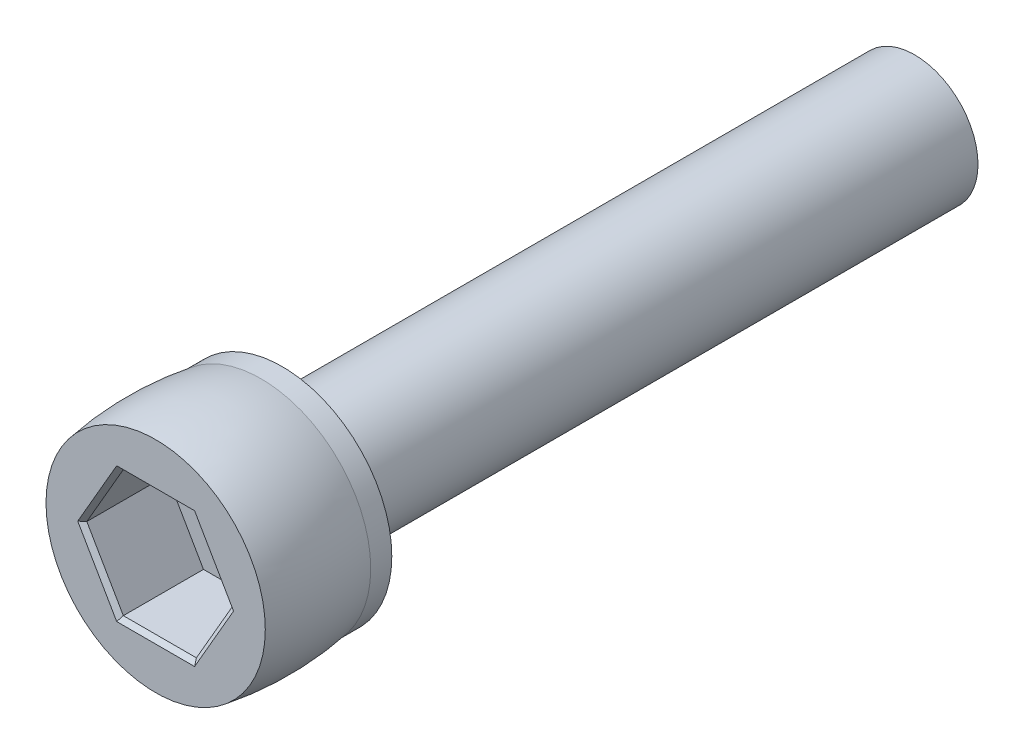
ISO-10303-21;
HEADER;
FILE_DESCRIPTION(('STEP AP214'),'2;1');
FILE_NAME('part.step','',(''),(''),'','','');
FILE_SCHEMA(('AUTOMOTIVE_DESIGN { 1 0 10303 214 1 1 1 1 }'));
ENDSEC;
DATA;
#1=APPLICATION_CONTEXT('core data for automotive mechanical design processes');
#2=APPLICATION_PROTOCOL_DEFINITION('international standard','automotive_design',2000,#1);
#3=PRODUCT_CONTEXT('',#1,'mechanical');
#4=PRODUCT('Part','Part','',(#3));
#5=PRODUCT_RELATED_PRODUCT_CATEGORY('part','',(#4));
#6=PRODUCT_DEFINITION_FORMATION('','',#4);
#7=PRODUCT_DEFINITION_CONTEXT('part definition',#1,'design');
#8=PRODUCT_DEFINITION('design','',#6,#7);
#9=PRODUCT_DEFINITION_SHAPE('','',#8);
#10=(LENGTH_UNIT() NAMED_UNIT(*) SI_UNIT(.MILLI.,.METRE.));
#11=(NAMED_UNIT(*) PLANE_ANGLE_UNIT() SI_UNIT($,.RADIAN.));
#12=(NAMED_UNIT(*) SI_UNIT($,.STERADIAN.) SOLID_ANGLE_UNIT());
#13=UNCERTAINTY_MEASURE_WITH_UNIT(LENGTH_MEASURE(1.E-05),#10,'distance_accuracy_value','');
#14=(GEOMETRIC_REPRESENTATION_CONTEXT(3) GLOBAL_UNCERTAINTY_ASSIGNED_CONTEXT((#13)) GLOBAL_UNIT_ASSIGNED_CONTEXT((#10,
#11,#12)) REPRESENTATION_CONTEXT('',''));
#15=CARTESIAN_POINT('',(0.,0.,0.));
#16=DIRECTION('',(0.,0.,1.));
#17=DIRECTION('',(1.,0.,0.));
#18=AXIS2_PLACEMENT_3D('',#15,#16,#17);
#19=CARTESIAN_POINT('',(0.,0.,0.));
#20=DIRECTION('',(0.,0.,1.));
#21=DIRECTION('',(1.,0.,0.));
#22=AXIS2_PLACEMENT_3D('',#19,#20,#21);
#23=PLANE('',#22);
#24=CARTESIAN_POINT('',(0.,0.,0.));
#25=DIRECTION('',(0.,0.,1.));
#26=DIRECTION('',(1.,0.,0.));
#27=AXIS2_PLACEMENT_3D('',#24,#25,#26);
#28=CIRCLE('',#27,1.5);
#29=CARTESIAN_POINT('',(1.5,0.,0.));
#30=VERTEX_POINT('',#29);
#31=EDGE_CURVE('E186',#30,#30,#28,.T.);
#32=ORIENTED_EDGE('',*,*,#31,.T.);
#33=EDGE_LOOP('',(#32));
#34=FACE_BOUND('',#33,.T.);
#35=CARTESIAN_POINT('',(0.,0.,0.));
#36=DIRECTION('',(0.,0.,-1.));
#37=DIRECTION('',(-1.,0.,0.));
#38=AXIS2_PLACEMENT_3D('',#35,#36,#37);
#39=CIRCLE('',#38,2.6);
#40=CARTESIAN_POINT('',(-2.6,0.,0.));
#41=VERTEX_POINT('',#40);
#42=EDGE_CURVE('E178',#41,#41,#39,.T.);
#43=ORIENTED_EDGE('',*,*,#42,.T.);
#44=EDGE_LOOP('',(#43));
#45=FACE_BOUND('',#44,.T.);
#46=ADVANCED_FACE('F43',(#34,#45),#23,.F.);
#47=CARTESIAN_POINT('',(0.,0.,-15.));
#48=DIRECTION('',(0.,0.,1.));
#49=DIRECTION('',(1.,0.,0.));
#50=AXIS2_PLACEMENT_3D('',#47,#48,#49);
#51=CYLINDRICAL_SURFACE('',#50,1.5);
#52=CARTESIAN_POINT('',(0.,0.,-15.));
#53=DIRECTION('',(0.,0.,1.));
#54=DIRECTION('',(1.,0.,0.));
#55=AXIS2_PLACEMENT_3D('',#52,#53,#54);
#56=CIRCLE('',#55,1.5);
#57=CARTESIAN_POINT('',(1.5,0.,-15.));
#58=VERTEX_POINT('',#57);
#59=EDGE_CURVE('E187',#58,#58,#56,.T.);
#60=ORIENTED_EDGE('',*,*,#59,.T.);
#61=EDGE_LOOP('',(#60));
#62=FACE_BOUND('',#61,.T.);
#63=ORIENTED_EDGE('',*,*,#31,.F.);
#64=EDGE_LOOP('',(#63));
#65=FACE_BOUND('',#64,.T.);
#66=ADVANCED_FACE('F275',(#62,#65),#51,.T.);
#67=CARTESIAN_POINT('',(0.,0.,-15.));
#68=DIRECTION('',(0.,0.,1.));
#69=DIRECTION('',(1.,0.,0.));
#70=AXIS2_PLACEMENT_3D('',#67,#68,#69);
#71=PLANE('',#70);
#72=ORIENTED_EDGE('',*,*,#59,.F.);
#73=EDGE_LOOP('',(#72));
#74=FACE_BOUND('',#73,.T.);
#75=ADVANCED_FACE('F281',(#74),#71,.F.);
#76=CARTESIAN_POINT('',(0.,0.,1.75));
#77=DIRECTION('',(0.,0.,-1.));
#78=DIRECTION('',(-1.,0.,0.));
#79=AXIS2_PLACEMENT_3D('',#76,#77,#78);
#80=DEGENERATE_TOROIDAL_SURFACE('',#79,5.16250000000011,7.86250000000011,.F.);
#81=CARTESIAN_POINT('',(0.,0.,3.));
#82=DIRECTION('',(0.,0.,-1.));
#83=DIRECTION('',(-1.,0.,0.));
#84=AXIS2_PLACEMENT_3D('',#81,#82,#83);
#85=CIRCLE('',#84,2.6);
#86=CARTESIAN_POINT('',(-2.6,0.,3.));
#87=VERTEX_POINT('',#86);
#88=EDGE_CURVE('E161',#87,#87,#85,.T.);
#89=ORIENTED_EDGE('',*,*,#88,.T.);
#90=EDGE_LOOP('',(#89));
#91=FACE_BOUND('',#90,.T.);
#92=CARTESIAN_POINT('',(0.,0.,0.5));
#93=DIRECTION('',(0.,0.,-1.));
#94=DIRECTION('',(-1.,0.,0.));
#95=AXIS2_PLACEMENT_3D('',#92,#93,#94);
#96=CIRCLE('',#95,2.6);
#97=CARTESIAN_POINT('',(-2.6,0.,0.5));
#98=VERTEX_POINT('',#97);
#99=EDGE_CURVE('E182',#98,#98,#96,.T.);
#100=ORIENTED_EDGE('',*,*,#99,.F.);
#101=EDGE_LOOP('',(#100));
#102=FACE_BOUND('',#101,.T.);
#103=ADVANCED_FACE('F290',(#91,#102),#80,.F.);
#104=CARTESIAN_POINT('',(0.,0.,3.));
#105=DIRECTION('',(0.,0.,-1.));
#106=DIRECTION('',(-1.,0.,0.));
#107=AXIS2_PLACEMENT_3D('',#104,#105,#106);
#108=CYLINDRICAL_SURFACE('',#107,2.6);
#109=ORIENTED_EDGE('',*,*,#42,.F.);
#110=EDGE_LOOP('',(#109));
#111=FACE_BOUND('',#110,.T.);
#112=ORIENTED_EDGE('',*,*,#99,.T.);
#113=EDGE_LOOP('',(#112));
#114=FACE_BOUND('',#113,.T.);
#115=ADVANCED_FACE('F396',(#111,#114),#108,.T.);
#116=CARTESIAN_POINT('',(0.,0.,3.));
#117=DIRECTION('',(0.,0.,1.));
#118=DIRECTION('',(1.,0.,0.));
#119=AXIS2_PLACEMENT_3D('',#116,#117,#118);
#120=PLANE('',#119);
#121=DIRECTION('',(-1.,0.,0.));
#122=VECTOR('',#121,1.);
#123=CARTESIAN_POINT('',(-0.866025403784439,-1.6,3.));
#124=LINE('',#123,#122);
#125=CARTESIAN_POINT('',(0.923760430703401,-1.6,3.));
#126=VERTEX_POINT('',#125);
#127=CARTESIAN_POINT('',(-0.9237604307034,-1.6,3.));
#128=VERTEX_POINT('',#127);
#129=EDGE_CURVE('E210',#126,#128,#124,.T.);
#130=ORIENTED_EDGE('',*,*,#129,.T.);
#131=DIRECTION('',(-0.5,0.866025403784439,0.));
#132=VECTOR('',#131,1.);
#133=CARTESIAN_POINT('',(-1.81865334794732,-0.0499999999999996,3.));
#134=LINE('',#133,#132);
#135=CARTESIAN_POINT('',(-1.8475208614068,0.,3.));
#136=VERTEX_POINT('',#135);
#137=EDGE_CURVE('E213',#128,#136,#134,.T.);
#138=ORIENTED_EDGE('',*,*,#137,.T.);
#139=DIRECTION('',(0.5,0.866025403784439,0.));
#140=VECTOR('',#139,1.);
#141=CARTESIAN_POINT('',(-0.952627944162882,1.55,3.));
#142=LINE('',#141,#140);
#143=CARTESIAN_POINT('',(-0.923760430703401,1.6,3.));
#144=VERTEX_POINT('',#143);
#145=EDGE_CURVE('E198',#136,#144,#142,.T.);
#146=ORIENTED_EDGE('',*,*,#145,.T.);
#147=DIRECTION('',(1.,0.,0.));
#148=VECTOR('',#147,1.);
#149=CARTESIAN_POINT('',(0.866025403784439,1.6,3.));
#150=LINE('',#149,#148);
#151=CARTESIAN_POINT('',(0.923760430703401,1.6,3.));
#152=VERTEX_POINT('',#151);
#153=EDGE_CURVE('E201',#144,#152,#150,.T.);
#154=ORIENTED_EDGE('',*,*,#153,.T.);
#155=DIRECTION('',(0.5,-0.866025403784438,0.));
#156=VECTOR('',#155,1.);
#157=CARTESIAN_POINT('',(1.81865334794732,0.0500000000000005,3.));
#158=LINE('',#157,#156);
#159=CARTESIAN_POINT('',(1.8475208614068,0.,3.));
#160=VERTEX_POINT('',#159);
#161=EDGE_CURVE('E204',#152,#160,#158,.T.);
#162=ORIENTED_EDGE('',*,*,#161,.T.);
#163=DIRECTION('',(-0.5,-0.866025403784439,0.));
#164=VECTOR('',#163,1.);
#165=CARTESIAN_POINT('',(0.952627944162882,-1.55,3.));
#166=LINE('',#165,#164);
#167=EDGE_CURVE('E207',#160,#126,#166,.T.);
#168=ORIENTED_EDGE('',*,*,#167,.T.);
#169=EDGE_LOOP('',(#130,#138,#146,#154,#162,#168));
#170=FACE_BOUND('',#169,.T.);
#171=ORIENTED_EDGE('',*,*,#88,.F.);
#172=EDGE_LOOP('',(#171));
#173=FACE_BOUND('',#172,.T.);
#174=ADVANCED_FACE('F287',(#170,#173),#120,.T.);
#175=CARTESIAN_POINT('',(0.866025403784439,-1.5,1.));
#176=DIRECTION('',(0.866025403784439,-0.5,0.));
#177=DIRECTION('',(0.5,0.866025403784439,0.));
#178=AXIS2_PLACEMENT_3D('',#175,#176,#177);
#179=PLANE('',#178);
#180=DIRECTION('',(0.,0.,1.));
#181=VECTOR('',#180,1.);
#182=CARTESIAN_POINT('',(0.866025403784439,-1.5,1.));
#183=LINE('',#182,#181);
#184=CARTESIAN_POINT('',(0.866025403784439,-1.5,1.));
#185=VERTEX_POINT('',#184);
#186=CARTESIAN_POINT('',(0.866025403784439,-1.5,2.9));
#187=VERTEX_POINT('',#186);
#188=EDGE_CURVE('E158',#185,#187,#183,.T.);
#189=ORIENTED_EDGE('',*,*,#188,.T.);
#190=DIRECTION('',(0.5,0.866025403784439,0.));
#191=VECTOR('',#190,1.);
#192=CARTESIAN_POINT('',(1.73205080756888,0.,2.9));
#193=LINE('',#192,#191);
#194=CARTESIAN_POINT('',(1.73205080756888,0.,2.9));
#195=VERTEX_POINT('',#194);
#196=EDGE_CURVE('E124',#187,#195,#193,.T.);
#197=ORIENTED_EDGE('',*,*,#196,.T.);
#198=DIRECTION('',(0.,0.,1.));
#199=VECTOR('',#198,1.);
#200=CARTESIAN_POINT('',(1.73205080756888,0.,1.));
#201=LINE('',#200,#199);
#202=CARTESIAN_POINT('',(1.73205080756888,0.,1.));
#203=VERTEX_POINT('',#202);
#204=EDGE_CURVE('E116',#203,#195,#201,.T.);
#205=ORIENTED_EDGE('',*,*,#204,.F.);
#206=DIRECTION('',(0.5,0.866025403784439,0.));
#207=VECTOR('',#206,1.);
#208=CARTESIAN_POINT('',(0.866025403784439,-1.5,1.));
#209=LINE('',#208,#207);
#210=EDGE_CURVE('E121',#185,#203,#209,.T.);
#211=ORIENTED_EDGE('',*,*,#210,.F.);
#212=EDGE_LOOP('',(#189,#197,#205,#211));
#213=FACE_BOUND('',#212,.T.);
#214=ADVANCED_FACE('F119',(#213),#179,.F.);
#215=CARTESIAN_POINT('',(-0.866025403784439,-1.5,1.));
#216=DIRECTION('',(0.,-1.,0.));
#217=DIRECTION('',(0.,0.,-1.));
#218=AXIS2_PLACEMENT_3D('',#215,#216,#217);
#219=PLANE('',#218);
#220=DIRECTION('',(0.,0.,1.));
#221=VECTOR('',#220,1.);
#222=CARTESIAN_POINT('',(-0.866025403784439,-1.5,1.));
#223=LINE('',#222,#221);
#224=CARTESIAN_POINT('',(-0.866025403784439,-1.5,1.));
#225=VERTEX_POINT('',#224);
#226=CARTESIAN_POINT('',(-0.866025403784439,-1.5,2.9));
#227=VERTEX_POINT('',#226);
#228=EDGE_CURVE('E162',#225,#227,#223,.T.);
#229=ORIENTED_EDGE('',*,*,#228,.T.);
#230=DIRECTION('',(1.,0.,0.));
#231=VECTOR('',#230,1.);
#232=CARTESIAN_POINT('',(0.866025403784439,-1.5,2.9));
#233=LINE('',#232,#231);
#234=EDGE_CURVE('E217',#227,#187,#233,.T.);
#235=ORIENTED_EDGE('',*,*,#234,.T.);
#236=ORIENTED_EDGE('',*,*,#188,.F.);
#237=DIRECTION('',(1.,0.,0.));
#238=VECTOR('',#237,1.);
#239=CARTESIAN_POINT('',(-0.866025403784439,-1.5,1.));
#240=LINE('',#239,#238);
#241=EDGE_CURVE('E127',#225,#185,#240,.T.);
#242=ORIENTED_EDGE('',*,*,#241,.F.);
#243=EDGE_LOOP('',(#229,#235,#236,#242));
#244=FACE_BOUND('',#243,.T.);
#245=ADVANCED_FACE('F330',(#244),#219,.F.);
#246=CARTESIAN_POINT('',(-1.73205080756888,0.,1.));
#247=DIRECTION('',(-0.866025403784439,-0.5,0.));
#248=DIRECTION('',(0.5,-0.866025403784439,0.));
#249=AXIS2_PLACEMENT_3D('',#246,#247,#248);
#250=PLANE('',#249);
#251=DIRECTION('',(0.,0.,1.));
#252=VECTOR('',#251,1.);
#253=CARTESIAN_POINT('',(-1.73205080756888,0.,1.));
#254=LINE('',#253,#252);
#255=CARTESIAN_POINT('',(-1.73205080756888,0.,1.));
#256=VERTEX_POINT('',#255);
#257=CARTESIAN_POINT('',(-1.73205080756888,0.,2.9));
#258=VERTEX_POINT('',#257);
#259=EDGE_CURVE('E166',#256,#258,#254,.T.);
#260=ORIENTED_EDGE('',*,*,#259,.T.);
#261=DIRECTION('',(0.5,-0.866025403784439,0.));
#262=VECTOR('',#261,1.);
#263=CARTESIAN_POINT('',(-0.866025403784439,-1.5,2.9));
#264=LINE('',#263,#262);
#265=EDGE_CURVE('E191',#258,#227,#264,.T.);
#266=ORIENTED_EDGE('',*,*,#265,.T.);
#267=ORIENTED_EDGE('',*,*,#228,.F.);
#268=DIRECTION('',(0.5,-0.866025403784439,0.));
#269=VECTOR('',#268,1.);
#270=CARTESIAN_POINT('',(-1.73205080756888,0.,1.));
#271=LINE('',#270,#269);
#272=EDGE_CURVE('E153',#256,#225,#271,.T.);
#273=ORIENTED_EDGE('',*,*,#272,.F.);
#274=EDGE_LOOP('',(#260,#266,#267,#273));
#275=FACE_BOUND('',#274,.T.);
#276=ADVANCED_FACE('F264',(#275),#250,.F.);
#277=CARTESIAN_POINT('',(-0.866025403784439,1.5,1.));
#278=DIRECTION('',(-0.866025403784439,0.5,0.));
#279=DIRECTION('',(-0.5,-0.866025403784439,0.));
#280=AXIS2_PLACEMENT_3D('',#277,#278,#279);
#281=PLANE('',#280);
#282=DIRECTION('',(0.,0.,1.));
#283=VECTOR('',#282,1.);
#284=CARTESIAN_POINT('',(-0.866025403784439,1.5,1.));
#285=LINE('',#284,#283);
#286=CARTESIAN_POINT('',(-0.866025403784439,1.5,1.));
#287=VERTEX_POINT('',#286);
#288=CARTESIAN_POINT('',(-0.866025403784439,1.5,2.9));
#289=VERTEX_POINT('',#288);
#290=EDGE_CURVE('E170',#287,#289,#285,.T.);
#291=ORIENTED_EDGE('',*,*,#290,.T.);
#292=DIRECTION('',(-0.5,-0.866025403784439,0.));
#293=VECTOR('',#292,1.);
#294=CARTESIAN_POINT('',(-1.73205080756888,0.,2.9));
#295=LINE('',#294,#293);
#296=EDGE_CURVE('E11',#289,#258,#295,.T.);
#297=ORIENTED_EDGE('',*,*,#296,.T.);
#298=ORIENTED_EDGE('',*,*,#259,.F.);
#299=DIRECTION('',(-0.5,-0.866025403784439,0.));
#300=VECTOR('',#299,1.);
#301=CARTESIAN_POINT('',(-0.866025403784439,1.5,1.));
#302=LINE('',#301,#300);
#303=EDGE_CURVE('E149',#287,#256,#302,.T.);
#304=ORIENTED_EDGE('',*,*,#303,.F.);
#305=EDGE_LOOP('',(#291,#297,#298,#304));
#306=FACE_BOUND('',#305,.T.);
#307=ADVANCED_FACE('F260',(#306),#281,.F.);
#308=CARTESIAN_POINT('',(0.866025403784439,1.5,1.));
#309=DIRECTION('',(0.,1.,0.));
#310=DIRECTION('',(0.,0.,1.));
#311=AXIS2_PLACEMENT_3D('',#308,#309,#310);
#312=PLANE('',#311);
#313=DIRECTION('',(0.,0.,1.));
#314=VECTOR('',#313,1.);
#315=CARTESIAN_POINT('',(0.866025403784439,1.5,1.));
#316=LINE('',#315,#314);
#317=CARTESIAN_POINT('',(0.866025403784439,1.5,1.));
#318=VERTEX_POINT('',#317);
#319=CARTESIAN_POINT('',(0.866025403784439,1.5,2.9));
#320=VERTEX_POINT('',#319);
#321=EDGE_CURVE('E126',#318,#320,#316,.T.);
#322=ORIENTED_EDGE('',*,*,#321,.T.);
#323=DIRECTION('',(-1.,0.,0.));
#324=VECTOR('',#323,1.);
#325=CARTESIAN_POINT('',(-0.866025403784439,1.5,2.9));
#326=LINE('',#325,#324);
#327=EDGE_CURVE('E54',#320,#289,#326,.T.);
#328=ORIENTED_EDGE('',*,*,#327,.T.);
#329=ORIENTED_EDGE('',*,*,#290,.F.);
#330=DIRECTION('',(-1.,0.,0.));
#331=VECTOR('',#330,1.);
#332=CARTESIAN_POINT('',(0.866025403784439,1.5,1.));
#333=LINE('',#332,#331);
#334=EDGE_CURVE('E136',#318,#287,#333,.T.);
#335=ORIENTED_EDGE('',*,*,#334,.F.);
#336=EDGE_LOOP('',(#322,#328,#329,#335));
#337=FACE_BOUND('',#336,.T.);
#338=ADVANCED_FACE('F265',(#337),#312,.F.);
#339=CARTESIAN_POINT('',(1.73205080756888,0.,1.));
#340=DIRECTION('',(0.866025403784438,0.5,0.));
#341=DIRECTION('',(-0.5,0.866025403784439,0.));
#342=AXIS2_PLACEMENT_3D('',#339,#340,#341);
#343=PLANE('',#342);
#344=ORIENTED_EDGE('',*,*,#204,.T.);
#345=DIRECTION('',(-0.5,0.866025403784439,0.));
#346=VECTOR('',#345,1.);
#347=CARTESIAN_POINT('',(0.866025403784438,1.5,2.9));
#348=LINE('',#347,#346);
#349=EDGE_CURVE('E69',#195,#320,#348,.T.);
#350=ORIENTED_EDGE('',*,*,#349,.T.);
#351=ORIENTED_EDGE('',*,*,#321,.F.);
#352=DIRECTION('',(-0.5,0.866025403784439,0.));
#353=VECTOR('',#352,1.);
#354=CARTESIAN_POINT('',(1.73205080756888,0.,1.));
#355=LINE('',#354,#353);
#356=EDGE_CURVE('E130',#203,#318,#355,.T.);
#357=ORIENTED_EDGE('',*,*,#356,.F.);
#358=EDGE_LOOP('',(#344,#350,#351,#357));
#359=FACE_BOUND('',#358,.T.);
#360=ADVANCED_FACE('F131',(#359),#343,.F.);
#361=CARTESIAN_POINT('',(0.,0.,1.));
#362=DIRECTION('',(0.,0.,1.));
#363=DIRECTION('',(1.,0.,0.));
#364=AXIS2_PLACEMENT_3D('',#361,#362,#363);
#365=PLANE('',#364);
#366=ORIENTED_EDGE('',*,*,#210,.T.);
#367=ORIENTED_EDGE('',*,*,#356,.T.);
#368=ORIENTED_EDGE('',*,*,#334,.T.);
#369=ORIENTED_EDGE('',*,*,#303,.T.);
#370=ORIENTED_EDGE('',*,*,#272,.T.);
#371=ORIENTED_EDGE('',*,*,#241,.T.);
#372=EDGE_LOOP('',(#366,#367,#368,#369,#370,#371));
#373=FACE_BOUND('',#372,.T.);
#374=ADVANCED_FACE('F138',(#373),#365,.T.);
#375=CARTESIAN_POINT('',(1.73205080756888,0.,2.9));
#376=DIRECTION('',(-0.612372435695799,-0.353553390593277,0.707106781186542));
#377=DIRECTION('',(0.5,-0.866025403784439,0.));
#378=AXIS2_PLACEMENT_3D('',#375,#376,#377);
#379=PLANE('',#378);
#380=DIRECTION('',(0.755928946018449,0.,0.654653670707983));
#381=VECTOR('',#380,1.);
#382=CARTESIAN_POINT('',(1.23717914826349,0.,2.47142857142857));
#383=LINE('',#382,#381);
#384=EDGE_CURVE('E145',#160,#195,#383,.F.);
#385=ORIENTED_EDGE('',*,*,#384,.F.);
#386=ORIENTED_EDGE('',*,*,#161,.F.);
#387=DIRECTION('',(0.377964473009226,0.654653670707972,0.654653670707983));
#388=VECTOR('',#387,1.);
#389=CARTESIAN_POINT('',(0.618589574131746,1.07142857142858,2.47142857142857));
#390=LINE('',#389,#388);
#391=EDGE_CURVE('E48',#320,#152,#390,.T.);
#392=ORIENTED_EDGE('',*,*,#391,.F.);
#393=ORIENTED_EDGE('',*,*,#349,.F.);
#394=EDGE_LOOP('',(#385,#386,#392,#393));
#395=FACE_BOUND('',#394,.T.);
#396=ADVANCED_FACE('F46',(#395),#379,.T.);
#397=CARTESIAN_POINT('',(0.866025403784439,1.5,2.9));
#398=DIRECTION('',(0.,-0.707106781186554,0.707106781186541));
#399=DIRECTION('',(1.,0.,0.));
#400=AXIS2_PLACEMENT_3D('',#397,#398,#399);
#401=PLANE('',#400);
#402=ORIENTED_EDGE('',*,*,#391,.T.);
#403=ORIENTED_EDGE('',*,*,#153,.F.);
#404=DIRECTION('',(-0.377964473009222,0.654653670707973,0.654653670707984));
#405=VECTOR('',#404,1.);
#406=CARTESIAN_POINT('',(-0.618589574131749,1.07142857142858,2.47142857142857));
#407=LINE('',#406,#405);
#408=EDGE_CURVE('E236',#289,#144,#407,.T.);
#409=ORIENTED_EDGE('',*,*,#408,.F.);
#410=ORIENTED_EDGE('',*,*,#327,.F.);
#411=EDGE_LOOP('',(#402,#403,#409,#410));
#412=FACE_BOUND('',#411,.T.);
#413=ADVANCED_FACE('F252',(#412),#401,.T.);
#414=CARTESIAN_POINT('',(0.866025403784439,-1.5,2.9));
#415=DIRECTION('',(-0.6123724356958,0.353553390593276,0.707106781186542));
#416=DIRECTION('',(-0.5,-0.866025403784439,0.));
#417=AXIS2_PLACEMENT_3D('',#414,#415,#416);
#418=PLANE('',#417);
#419=ORIENTED_EDGE('',*,*,#384,.T.);
#420=ORIENTED_EDGE('',*,*,#196,.F.);
#421=DIRECTION('',(0.377964473009225,-0.654653670707972,0.654653670707983));
#422=VECTOR('',#421,1.);
#423=CARTESIAN_POINT('',(0.618589574131745,-1.07142857142858,2.47142857142857));
#424=LINE('',#423,#422);
#425=EDGE_CURVE('E232',#126,#187,#424,.F.);
#426=ORIENTED_EDGE('',*,*,#425,.F.);
#427=ORIENTED_EDGE('',*,*,#167,.F.);
#428=EDGE_LOOP('',(#419,#420,#426,#427));
#429=FACE_BOUND('',#428,.T.);
#430=ADVANCED_FACE('F244',(#429),#418,.T.);
#431=CARTESIAN_POINT('',(-0.866025403784439,1.5,2.9));
#432=DIRECTION('',(0.612372435695801,-0.353553390593277,0.70710678118654));
#433=DIRECTION('',(0.5,0.866025403784439,0.));
#434=AXIS2_PLACEMENT_3D('',#431,#432,#433);
#435=PLANE('',#434);
#436=ORIENTED_EDGE('',*,*,#408,.T.);
#437=ORIENTED_EDGE('',*,*,#145,.F.);
#438=DIRECTION('',(0.755928946018448,0.,-0.654653670707985));
#439=VECTOR('',#438,1.);
#440=CARTESIAN_POINT('',(-1.73205080756888,0.,2.9));
#441=LINE('',#440,#439);
#442=EDGE_CURVE('E229',#258,#136,#441,.F.);
#443=ORIENTED_EDGE('',*,*,#442,.F.);
#444=ORIENTED_EDGE('',*,*,#296,.F.);
#445=EDGE_LOOP('',(#436,#437,#443,#444));
#446=FACE_BOUND('',#445,.T.);
#447=ADVANCED_FACE('F257',(#446),#435,.T.);
#448=CARTESIAN_POINT('',(-0.866025403784439,-1.5,2.9));
#449=DIRECTION('',(0.,0.707106781186554,0.707106781186541));
#450=DIRECTION('',(-1.,0.,0.));
#451=AXIS2_PLACEMENT_3D('',#448,#449,#450);
#452=PLANE('',#451);
#453=ORIENTED_EDGE('',*,*,#425,.T.);
#454=ORIENTED_EDGE('',*,*,#234,.F.);
#455=DIRECTION('',(-0.377964473009222,-0.654653670707973,0.654653670707984));
#456=VECTOR('',#455,1.);
#457=CARTESIAN_POINT('',(-0.618589574131746,-1.07142857142858,2.47142857142857));
#458=LINE('',#457,#456);
#459=EDGE_CURVE('E226',#128,#227,#458,.F.);
#460=ORIENTED_EDGE('',*,*,#459,.F.);
#461=ORIENTED_EDGE('',*,*,#129,.F.);
#462=EDGE_LOOP('',(#453,#454,#460,#461));
#463=FACE_BOUND('',#462,.T.);
#464=ADVANCED_FACE('F300',(#463),#452,.T.);
#465=CARTESIAN_POINT('',(-1.73205080756888,0.,2.9));
#466=DIRECTION('',(0.612372435695801,0.353553390593277,0.70710678118654));
#467=DIRECTION('',(-0.5,0.866025403784439,0.));
#468=AXIS2_PLACEMENT_3D('',#465,#466,#467);
#469=PLANE('',#468);
#470=ORIENTED_EDGE('',*,*,#442,.T.);
#471=ORIENTED_EDGE('',*,*,#137,.F.);
#472=ORIENTED_EDGE('',*,*,#459,.T.);
#473=ORIENTED_EDGE('',*,*,#265,.F.);
#474=EDGE_LOOP('',(#470,#471,#472,#473));
#475=FACE_BOUND('',#474,.T.);
#476=ADVANCED_FACE('F294',(#475),#469,.T.);
#477=CLOSED_SHELL('',(#46,#66,#75,#103,#115,#174,#214,#245,#276,#307,#338,#360,#374,#396,#413,
#430,#447,#464,#476));
#478=MANIFOLD_SOLID_BREP('B2',#477);
#479=ADVANCED_BREP_SHAPE_REPRESENTATION('',(#18,#478),#14);
#480=SHAPE_DEFINITION_REPRESENTATION(#9,#479);
ENDSEC;
END-ISO-10303-21;
